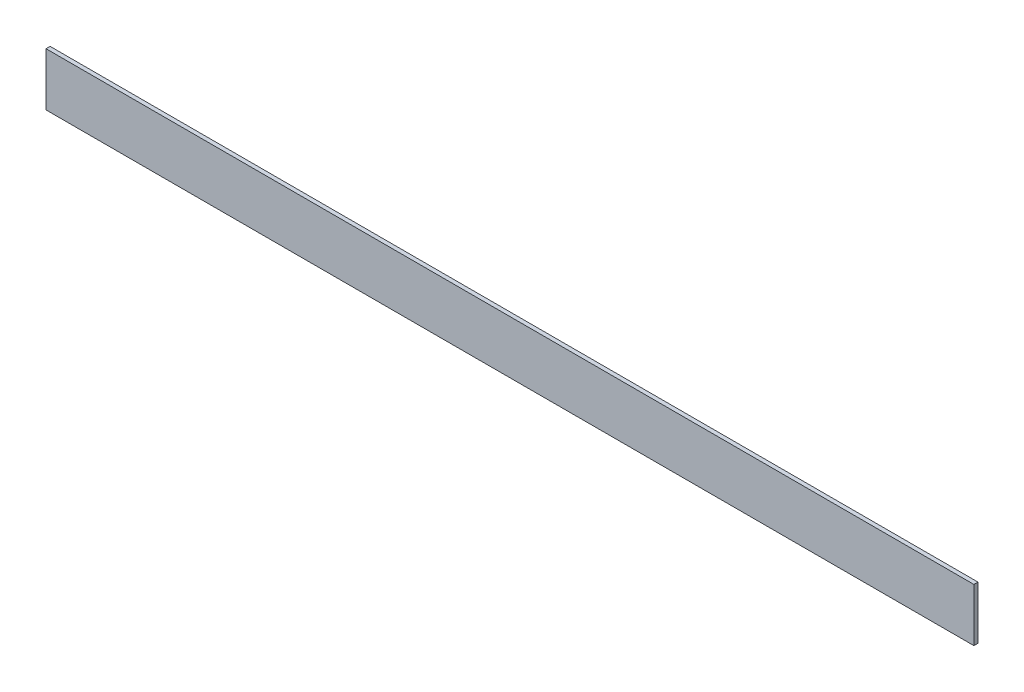
ISO-10303-21;
HEADER;
FILE_DESCRIPTION(('STEP AP214'),'2;1');
FILE_NAME('part.step','',(''),(''),'','','');
FILE_SCHEMA(('AUTOMOTIVE_DESIGN { 1 0 10303 214 1 1 1 1 }'));
ENDSEC;
DATA;
#1=APPLICATION_CONTEXT('core data for automotive mechanical design processes');
#2=APPLICATION_PROTOCOL_DEFINITION('international standard','automotive_design',2000,#1);
#3=PRODUCT_CONTEXT('',#1,'mechanical');
#4=PRODUCT('Part','Part','',(#3));
#5=PRODUCT_RELATED_PRODUCT_CATEGORY('part','',(#4));
#6=PRODUCT_DEFINITION_FORMATION('','',#4);
#7=PRODUCT_DEFINITION_CONTEXT('part definition',#1,'design');
#8=PRODUCT_DEFINITION('design','',#6,#7);
#9=PRODUCT_DEFINITION_SHAPE('','',#8);
#10=(LENGTH_UNIT() NAMED_UNIT(*) SI_UNIT(.MILLI.,.METRE.));
#11=(NAMED_UNIT(*) PLANE_ANGLE_UNIT() SI_UNIT($,.RADIAN.));
#12=(NAMED_UNIT(*) SI_UNIT($,.STERADIAN.) SOLID_ANGLE_UNIT());
#13=UNCERTAINTY_MEASURE_WITH_UNIT(LENGTH_MEASURE(1.E-05),#10,'distance_accuracy_value','');
#14=(GEOMETRIC_REPRESENTATION_CONTEXT(3) GLOBAL_UNCERTAINTY_ASSIGNED_CONTEXT((#13)) GLOBAL_UNIT_ASSIGNED_CONTEXT((#10,
#11,#12)) REPRESENTATION_CONTEXT('',''));
#15=CARTESIAN_POINT('',(0.,0.,0.));
#16=DIRECTION('',(0.,0.,1.));
#17=DIRECTION('',(1.,0.,0.));
#18=AXIS2_PLACEMENT_3D('',#15,#16,#17);
#19=CARTESIAN_POINT('',(-173.489347611488,-199.299072168843,-861.486147986318));
#20=DIRECTION('',(0.,0.,1.));
#21=DIRECTION('',(1.,0.,0.));
#22=AXIS2_PLACEMENT_3D('',#19,#20,#21);
#23=PLANE('',#22);
#24=DIRECTION('',(1.,0.,0.));
#25=VECTOR('',#24,1.);
#26=CARTESIAN_POINT('',(-173.489347611488,-225.299072168843,-861.486147986318));
#27=LINE('',#26,#25);
#28=CARTESIAN_POINT('',(281.510652388512,-225.299072168843,-861.486147986318));
#29=VERTEX_POINT('',#28);
#30=CARTESIAN_POINT('',(-628.489347611488,-225.299072168843,-861.486147986318));
#31=VERTEX_POINT('',#30);
#32=EDGE_CURVE('E90',#29,#31,#27,.F.);
#33=ORIENTED_EDGE('',*,*,#32,.T.);
#34=DIRECTION('',(0.,1.,0.));
#35=VECTOR('',#34,1.);
#36=CARTESIAN_POINT('',(-628.489347611488,-199.299072168843,-861.486147986318));
#37=LINE('',#36,#35);
#38=CARTESIAN_POINT('',(-628.489347611488,-173.299072168843,-861.486147986318));
#39=VERTEX_POINT('',#38);
#40=EDGE_CURVE('E56',#31,#39,#37,.T.);
#41=ORIENTED_EDGE('',*,*,#40,.T.);
#42=DIRECTION('',(1.,0.,0.));
#43=VECTOR('',#42,1.);
#44=CARTESIAN_POINT('',(-173.489347611488,-173.299072168843,-861.486147986318));
#45=LINE('',#44,#43);
#46=CARTESIAN_POINT('',(281.510652388512,-173.299072168843,-861.486147986318));
#47=VERTEX_POINT('',#46);
#48=EDGE_CURVE('E58',#39,#47,#45,.T.);
#49=ORIENTED_EDGE('',*,*,#48,.T.);
#50=DIRECTION('',(0.,1.,0.));
#51=VECTOR('',#50,1.);
#52=CARTESIAN_POINT('',(281.510652388512,-199.299072168843,-861.486147986318));
#53=LINE('',#52,#51);
#54=EDGE_CURVE('E20',#47,#29,#53,.F.);
#55=ORIENTED_EDGE('',*,*,#54,.T.);
#56=EDGE_LOOP('',(#33,#41,#49,#55));
#57=FACE_BOUND('',#56,.T.);
#58=ADVANCED_FACE('F17',(#57),#23,.F.);
#59=CARTESIAN_POINT('',(281.510652388512,-199.299072168843,-859.486147986318));
#60=DIRECTION('',(-1.,0.,0.));
#61=DIRECTION('',(0.,0.,1.));
#62=AXIS2_PLACEMENT_3D('',#59,#60,#61);
#63=PLANE('',#62);
#64=ORIENTED_EDGE('',*,*,#54,.F.);
#65=DIRECTION('',(0.,0.,-1.));
#66=VECTOR('',#65,1.);
#67=CARTESIAN_POINT('',(281.510652388512,-173.299072168843,-859.486147986318));
#68=LINE('',#67,#66);
#69=CARTESIAN_POINT('',(281.510652388512,-173.299072168843,-857.486147986319));
#70=VERTEX_POINT('',#69);
#71=EDGE_CURVE('E65',#47,#70,#68,.F.);
#72=ORIENTED_EDGE('',*,*,#71,.T.);
#73=DIRECTION('',(0.,1.,0.));
#74=VECTOR('',#73,1.);
#75=CARTESIAN_POINT('',(281.510652388512,-199.299072168843,-857.486147986319));
#76=LINE('',#75,#74);
#77=CARTESIAN_POINT('',(281.510652388512,-225.299072168843,-857.486147986319));
#78=VERTEX_POINT('',#77);
#79=EDGE_CURVE('E94',#78,#70,#76,.T.);
#80=ORIENTED_EDGE('',*,*,#79,.F.);
#81=DIRECTION('',(0.,0.,1.));
#82=VECTOR('',#81,1.);
#83=CARTESIAN_POINT('',(281.510652388512,-225.299072168843,-859.486147986318));
#84=LINE('',#83,#82);
#85=EDGE_CURVE('E70',#78,#29,#84,.F.);
#86=ORIENTED_EDGE('',*,*,#85,.T.);
#87=EDGE_LOOP('',(#64,#72,#80,#86));
#88=FACE_BOUND('',#87,.T.);
#89=ADVANCED_FACE('F67',(#88),#63,.F.);
#90=CARTESIAN_POINT('',(-173.489347611488,-173.299072168843,-859.486147986318));
#91=DIRECTION('',(0.,-1.,0.));
#92=DIRECTION('',(0.,0.,-1.));
#93=AXIS2_PLACEMENT_3D('',#90,#91,#92);
#94=PLANE('',#93);
#95=ORIENTED_EDGE('',*,*,#48,.F.);
#96=DIRECTION('',(0.,0.,-1.));
#97=VECTOR('',#96,1.);
#98=CARTESIAN_POINT('',(-628.489347611488,-173.299072168843,-859.486147986318));
#99=LINE('',#98,#97);
#100=CARTESIAN_POINT('',(-628.489347611488,-173.299072168843,-857.486147986319));
#101=VERTEX_POINT('',#100);
#102=EDGE_CURVE('E83',#39,#101,#99,.F.);
#103=ORIENTED_EDGE('',*,*,#102,.T.);
#104=DIRECTION('',(1.,0.,0.));
#105=VECTOR('',#104,1.);
#106=CARTESIAN_POINT('',(-173.489347611488,-173.299072168843,-857.486147986319));
#107=LINE('',#106,#105);
#108=EDGE_CURVE('E75',#70,#101,#107,.F.);
#109=ORIENTED_EDGE('',*,*,#108,.F.);
#110=ORIENTED_EDGE('',*,*,#71,.F.);
#111=EDGE_LOOP('',(#95,#103,#109,#110));
#112=FACE_BOUND('',#111,.T.);
#113=ADVANCED_FACE('F73',(#112),#94,.F.);
#114=CARTESIAN_POINT('',(-628.489347611488,-199.299072168843,-859.486147986318));
#115=DIRECTION('',(1.,0.,0.));
#116=DIRECTION('',(0.,0.,-1.));
#117=AXIS2_PLACEMENT_3D('',#114,#115,#116);
#118=PLANE('',#117);
#119=ORIENTED_EDGE('',*,*,#40,.F.);
#120=DIRECTION('',(0.,0.,1.));
#121=VECTOR('',#120,1.);
#122=CARTESIAN_POINT('',(-628.489347611488,-225.299072168843,-859.486147986318));
#123=LINE('',#122,#121);
#124=CARTESIAN_POINT('',(-628.489347611488,-225.299072168843,-857.486147986319));
#125=VERTEX_POINT('',#124);
#126=EDGE_CURVE('E36',#31,#125,#123,.T.);
#127=ORIENTED_EDGE('',*,*,#126,.T.);
#128=DIRECTION('',(0.,1.,0.));
#129=VECTOR('',#128,1.);
#130=CARTESIAN_POINT('',(-628.489347611488,-199.299072168843,-857.486147986319));
#131=LINE('',#130,#129);
#132=EDGE_CURVE('E27',#101,#125,#131,.F.);
#133=ORIENTED_EDGE('',*,*,#132,.F.);
#134=ORIENTED_EDGE('',*,*,#102,.F.);
#135=EDGE_LOOP('',(#119,#127,#133,#134));
#136=FACE_BOUND('',#135,.T.);
#137=ADVANCED_FACE('F102',(#136),#118,.F.);
#138=CARTESIAN_POINT('',(-173.489347611488,-225.299072168843,-859.486147986318));
#139=DIRECTION('',(0.,1.,0.));
#140=DIRECTION('',(0.,0.,1.));
#141=AXIS2_PLACEMENT_3D('',#138,#139,#140);
#142=PLANE('',#141);
#143=ORIENTED_EDGE('',*,*,#32,.F.);
#144=ORIENTED_EDGE('',*,*,#85,.F.);
#145=DIRECTION('',(1.,0.,0.));
#146=VECTOR('',#145,1.);
#147=CARTESIAN_POINT('',(-173.489347611488,-225.299072168843,-857.486147986319));
#148=LINE('',#147,#146);
#149=EDGE_CURVE('E11',#125,#78,#148,.T.);
#150=ORIENTED_EDGE('',*,*,#149,.F.);
#151=ORIENTED_EDGE('',*,*,#126,.F.);
#152=EDGE_LOOP('',(#143,#144,#150,#151));
#153=FACE_BOUND('',#152,.T.);
#154=ADVANCED_FACE('F104',(#153),#142,.F.);
#155=CARTESIAN_POINT('',(-173.489347611488,-199.299072168843,-857.486147986319));
#156=DIRECTION('',(0.,0.,1.));
#157=DIRECTION('',(1.,0.,0.));
#158=AXIS2_PLACEMENT_3D('',#155,#156,#157);
#159=PLANE('',#158);
#160=ORIENTED_EDGE('',*,*,#132,.T.);
#161=ORIENTED_EDGE('',*,*,#149,.T.);
#162=ORIENTED_EDGE('',*,*,#79,.T.);
#163=ORIENTED_EDGE('',*,*,#108,.T.);
#164=EDGE_LOOP('',(#160,#161,#162,#163));
#165=FACE_BOUND('',#164,.T.);
#166=ADVANCED_FACE('F101',(#165),#159,.T.);
#167=CLOSED_SHELL('',(#58,#89,#113,#137,#154,#166));
#168=MANIFOLD_SOLID_BREP('B1',#167);
#169=ADVANCED_BREP_SHAPE_REPRESENTATION('',(#18,#168),#14);
#170=SHAPE_DEFINITION_REPRESENTATION(#9,#169);
ENDSEC;
END-ISO-10303-21;
